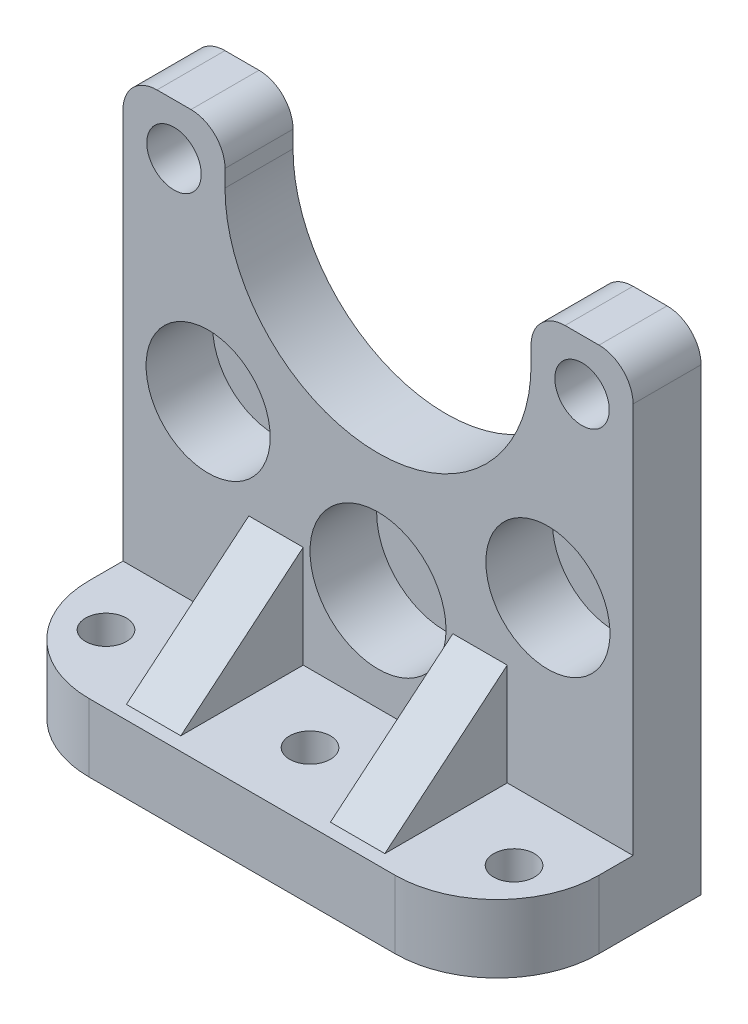
ISO-10303-21;
HEADER;
FILE_DESCRIPTION(('STEP AP214'),'2;1');
FILE_NAME('part.step','',(''),(''),'','','');
FILE_SCHEMA(('AUTOMOTIVE_DESIGN { 1 0 10303 214 1 1 1 1 }'));
ENDSEC;
DATA;
#1=APPLICATION_CONTEXT('core data for automotive mechanical design processes');
#2=APPLICATION_PROTOCOL_DEFINITION('international standard','automotive_design',2000,#1);
#3=PRODUCT_CONTEXT('',#1,'mechanical');
#4=PRODUCT('Part','Part','',(#3));
#5=PRODUCT_RELATED_PRODUCT_CATEGORY('part','',(#4));
#6=PRODUCT_DEFINITION_FORMATION('','',#4);
#7=PRODUCT_DEFINITION_CONTEXT('part definition',#1,'design');
#8=PRODUCT_DEFINITION('design','',#6,#7);
#9=PRODUCT_DEFINITION_SHAPE('','',#8);
#10=(LENGTH_UNIT() NAMED_UNIT(*) SI_UNIT(.MILLI.,.METRE.));
#11=(NAMED_UNIT(*) PLANE_ANGLE_UNIT() SI_UNIT($,.RADIAN.));
#12=(NAMED_UNIT(*) SI_UNIT($,.STERADIAN.) SOLID_ANGLE_UNIT());
#13=UNCERTAINTY_MEASURE_WITH_UNIT(LENGTH_MEASURE(1.E-05),#10,'distance_accuracy_value','');
#14=(GEOMETRIC_REPRESENTATION_CONTEXT(3) GLOBAL_UNCERTAINTY_ASSIGNED_CONTEXT((#13)) GLOBAL_UNIT_ASSIGNED_CONTEXT((#10,
#11,#12)) REPRESENTATION_CONTEXT('',''));
#15=CARTESIAN_POINT('',(0.,0.,0.));
#16=DIRECTION('',(0.,0.,1.));
#17=DIRECTION('',(1.,0.,0.));
#18=AXIS2_PLACEMENT_3D('',#15,#16,#17);
#19=CARTESIAN_POINT('',(0.,0.,10.));
#20=DIRECTION('',(0.,0.,-1.));
#21=DIRECTION('',(-1.,0.,0.));
#22=AXIS2_PLACEMENT_3D('',#19,#20,#21);
#23=PLANE('',#22);
#24=CARTESIAN_POINT('',(62.4807657696632,36.5792554758283,10.));
#25=DIRECTION('',(0.,0.,1.));
#26=DIRECTION('',(-1.,0.,0.));
#27=AXIS2_PLACEMENT_3D('',#24,#25,#26);
#28=CIRCLE('',#27,9.12473390152843);
#29=CARTESIAN_POINT('',(53.3560318681348,36.5792554758283,10.));
#30=VERTEX_POINT('',#29);
#31=EDGE_CURVE('E544',#30,#30,#28,.T.);
#32=ORIENTED_EDGE('',*,*,#31,.F.);
#33=EDGE_LOOP('',(#32));
#34=FACE_BOUND('',#33,.T.);
#35=CARTESIAN_POINT('',(12.5192342303368,36.5792554758283,10.));
#36=DIRECTION('',(0.,0.,1.));
#37=DIRECTION('',(1.,0.,0.));
#38=AXIS2_PLACEMENT_3D('',#35,#36,#37);
#39=CIRCLE('',#38,9.12473390152843);
#40=CARTESIAN_POINT('',(21.6439681318652,36.5792554758283,10.));
#41=VERTEX_POINT('',#40);
#42=EDGE_CURVE('E548',#41,#41,#39,.T.);
#43=ORIENTED_EDGE('',*,*,#42,.F.);
#44=EDGE_LOOP('',(#43));
#45=FACE_BOUND('',#44,.T.);
#46=CARTESIAN_POINT('',(37.5,25.,10.));
#47=DIRECTION('',(0.,0.,1.));
#48=DIRECTION('',(1.,0.,0.));
#49=AXIS2_PLACEMENT_3D('',#46,#47,#48);
#50=CIRCLE('',#49,10.);
#51=CARTESIAN_POINT('',(47.5,25.,10.));
#52=VERTEX_POINT('',#51);
#53=EDGE_CURVE('E557',#52,#52,#50,.T.);
#54=ORIENTED_EDGE('',*,*,#53,.F.);
#55=EDGE_LOOP('',(#54));
#56=FACE_BOUND('',#55,.T.);
#57=CARTESIAN_POINT('',(67.5,65.,10.));
#58=DIRECTION('',(0.,0.,1.));
#59=DIRECTION('',(-1.,0.,0.));
#60=AXIS2_PLACEMENT_3D('',#57,#58,#59);
#61=CIRCLE('',#60,4.00000000000002);
#62=CARTESIAN_POINT('',(63.5,65.,10.));
#63=VERTEX_POINT('',#62);
#64=EDGE_CURVE('E563',#63,#63,#61,.T.);
#65=ORIENTED_EDGE('',*,*,#64,.F.);
#66=EDGE_LOOP('',(#65));
#67=FACE_BOUND('',#66,.T.);
#68=CARTESIAN_POINT('',(7.49999999999999,65.,10.));
#69=DIRECTION('',(0.,0.,1.));
#70=DIRECTION('',(1.,0.,0.));
#71=AXIS2_PLACEMENT_3D('',#68,#69,#70);
#72=CIRCLE('',#71,4.);
#73=CARTESIAN_POINT('',(11.5,65.,10.));
#74=VERTEX_POINT('',#73);
#75=EDGE_CURVE('E569',#74,#74,#72,.T.);
#76=ORIENTED_EDGE('',*,*,#75,.F.);
#77=EDGE_LOOP('',(#76));
#78=FACE_BOUND('',#77,.T.);
#79=DIRECTION('',(-1.,0.,0.));
#80=VECTOR('',#79,1.);
#81=CARTESIAN_POINT('',(0.,72.5,10.));
#82=LINE('',#81,#80);
#83=CARTESIAN_POINT('',(10.,72.5,10.));
#84=VERTEX_POINT('',#83);
#85=CARTESIAN_POINT('',(4.99999999999997,72.5,10.));
#86=VERTEX_POINT('',#85);
#87=EDGE_CURVE('E283',#84,#86,#82,.T.);
#88=ORIENTED_EDGE('',*,*,#87,.T.);
#89=CARTESIAN_POINT('',(4.99999999999997,67.5,10.));
#90=DIRECTION('',(0.,0.,-1.));
#91=DIRECTION('',(-1.,0.,0.));
#92=AXIS2_PLACEMENT_3D('',#89,#90,#91);
#93=CIRCLE('',#92,5.);
#94=CARTESIAN_POINT('',(0.,67.5,10.));
#95=VERTEX_POINT('',#94);
#96=EDGE_CURVE('E424',#86,#95,#93,.F.);
#97=ORIENTED_EDGE('',*,*,#96,.T.);
#98=DIRECTION('',(0.,-1.,0.));
#99=VECTOR('',#98,1.);
#100=CARTESIAN_POINT('',(0.,0.,10.));
#101=LINE('',#100,#99);
#102=CARTESIAN_POINT('',(0.,10.,10.));
#103=VERTEX_POINT('',#102);
#104=EDGE_CURVE('E265',#95,#103,#101,.T.);
#105=ORIENTED_EDGE('',*,*,#104,.T.);
#106=DIRECTION('',(-1.,0.,0.));
#107=VECTOR('',#106,1.);
#108=CARTESIAN_POINT('',(0.,10.,10.));
#109=LINE('',#108,#107);
#110=CARTESIAN_POINT('',(18.5,10.,10.));
#111=VERTEX_POINT('',#110);
#112=EDGE_CURVE('E210',#111,#103,#109,.T.);
#113=ORIENTED_EDGE('',*,*,#112,.F.);
#114=DIRECTION('',(0.,-1.,0.));
#115=VECTOR('',#114,1.);
#116=CARTESIAN_POINT('',(18.5,10.,10.));
#117=LINE('',#116,#115);
#118=CARTESIAN_POINT('',(18.5,25.,10.));
#119=VERTEX_POINT('',#118);
#120=EDGE_CURVE('E201',#119,#111,#117,.T.);
#121=ORIENTED_EDGE('',*,*,#120,.F.);
#122=DIRECTION('',(-1.,0.,0.));
#123=VECTOR('',#122,1.);
#124=CARTESIAN_POINT('',(18.5,25.,10.));
#125=LINE('',#124,#123);
#126=CARTESIAN_POINT('',(26.5,25.,10.));
#127=VERTEX_POINT('',#126);
#128=EDGE_CURVE('E183',#127,#119,#125,.T.);
#129=ORIENTED_EDGE('',*,*,#128,.F.);
#130=DIRECTION('',(0.,1.,0.));
#131=VECTOR('',#130,1.);
#132=CARTESIAN_POINT('',(26.5,10.,10.));
#133=LINE('',#132,#131);
#134=CARTESIAN_POINT('',(26.5,10.,10.));
#135=VERTEX_POINT('',#134);
#136=EDGE_CURVE('E195',#135,#127,#133,.T.);
#137=ORIENTED_EDGE('',*,*,#136,.F.);
#138=CARTESIAN_POINT('',(48.5,10.,10.));
#139=VERTEX_POINT('',#138);
#140=EDGE_CURVE('E262',#139,#135,#109,.T.);
#141=ORIENTED_EDGE('',*,*,#140,.F.);
#142=DIRECTION('',(0.,-1.,0.));
#143=VECTOR('',#142,1.);
#144=CARTESIAN_POINT('',(48.5,10.,10.));
#145=LINE('',#144,#143);
#146=CARTESIAN_POINT('',(48.5,25.,10.));
#147=VERTEX_POINT('',#146);
#148=EDGE_CURVE('E585',#147,#139,#145,.T.);
#149=ORIENTED_EDGE('',*,*,#148,.F.);
#150=DIRECTION('',(-1.,0.,0.));
#151=VECTOR('',#150,1.);
#152=CARTESIAN_POINT('',(56.5,25.,10.));
#153=LINE('',#152,#151);
#154=CARTESIAN_POINT('',(56.5,25.,10.));
#155=VERTEX_POINT('',#154);
#156=EDGE_CURVE('E583',#155,#147,#153,.T.);
#157=ORIENTED_EDGE('',*,*,#156,.F.);
#158=DIRECTION('',(0.,1.,0.));
#159=VECTOR('',#158,1.);
#160=CARTESIAN_POINT('',(56.5,10.,10.));
#161=LINE('',#160,#159);
#162=CARTESIAN_POINT('',(56.5,10.,10.));
#163=VERTEX_POINT('',#162);
#164=EDGE_CURVE('E579',#163,#155,#161,.T.);
#165=ORIENTED_EDGE('',*,*,#164,.F.);
#166=CARTESIAN_POINT('',(75.,10.,10.));
#167=VERTEX_POINT('',#166);
#168=EDGE_CURVE('E246',#167,#163,#109,.T.);
#169=ORIENTED_EDGE('',*,*,#168,.F.);
#170=DIRECTION('',(0.,1.,0.));
#171=VECTOR('',#170,1.);
#172=CARTESIAN_POINT('',(75.,0.,10.));
#173=LINE('',#172,#171);
#174=CARTESIAN_POINT('',(75.,67.5,10.));
#175=VERTEX_POINT('',#174);
#176=EDGE_CURVE('E268',#167,#175,#173,.T.);
#177=ORIENTED_EDGE('',*,*,#176,.T.);
#178=CARTESIAN_POINT('',(70.,67.5,10.));
#179=DIRECTION('',(0.,0.,-1.));
#180=DIRECTION('',(-1.,0.,0.));
#181=AXIS2_PLACEMENT_3D('',#178,#179,#180);
#182=CIRCLE('',#181,5.);
#183=CARTESIAN_POINT('',(70.,72.5,10.));
#184=VERTEX_POINT('',#183);
#185=EDGE_CURVE('E413',#175,#184,#182,.F.);
#186=ORIENTED_EDGE('',*,*,#185,.T.);
#187=CARTESIAN_POINT('',(65.,72.5,10.));
#188=VERTEX_POINT('',#187);
#189=EDGE_CURVE('E279',#184,#188,#82,.T.);
#190=ORIENTED_EDGE('',*,*,#189,.T.);
#191=CARTESIAN_POINT('',(65.,67.5,10.));
#192=DIRECTION('',(0.,0.,-1.));
#193=DIRECTION('',(-1.,0.,0.));
#194=AXIS2_PLACEMENT_3D('',#191,#192,#193);
#195=CIRCLE('',#194,5.);
#196=CARTESIAN_POINT('',(60.,67.5,10.));
#197=VERTEX_POINT('',#196);
#198=EDGE_CURVE('E428',#188,#197,#195,.F.);
#199=ORIENTED_EDGE('',*,*,#198,.T.);
#200=DIRECTION('',(0.,1.,0.));
#201=VECTOR('',#200,1.);
#202=CARTESIAN_POINT('',(60.,65.,10.));
#203=LINE('',#202,#201);
#204=CARTESIAN_POINT('',(60.,65.,10.));
#205=VERTEX_POINT('',#204);
#206=EDGE_CURVE('E320',#205,#197,#203,.T.);
#207=ORIENTED_EDGE('',*,*,#206,.F.);
#208=CARTESIAN_POINT('',(37.5,65.,10.));
#209=DIRECTION('',(0.,0.,1.));
#210=DIRECTION('',(1.,0.,0.));
#211=AXIS2_PLACEMENT_3D('',#208,#209,#210);
#212=CIRCLE('',#211,22.5);
#213=CARTESIAN_POINT('',(15.,65.,10.));
#214=VERTEX_POINT('',#213);
#215=EDGE_CURVE('E325',#214,#205,#212,.T.);
#216=ORIENTED_EDGE('',*,*,#215,.F.);
#217=DIRECTION('',(0.,-1.,0.));
#218=VECTOR('',#217,1.);
#219=CARTESIAN_POINT('',(15.,65.,10.));
#220=LINE('',#219,#218);
#221=CARTESIAN_POINT('',(15.,67.5,10.));
#222=VERTEX_POINT('',#221);
#223=EDGE_CURVE('E252',#222,#214,#220,.T.);
#224=ORIENTED_EDGE('',*,*,#223,.F.);
#225=CARTESIAN_POINT('',(10.,67.5,10.));
#226=DIRECTION('',(0.,0.,-1.));
#227=DIRECTION('',(-1.,0.,0.));
#228=AXIS2_PLACEMENT_3D('',#225,#226,#227);
#229=CIRCLE('',#228,5.);
#230=EDGE_CURVE('E426',#222,#84,#229,.F.);
#231=ORIENTED_EDGE('',*,*,#230,.T.);
#232=EDGE_LOOP('',(#88,#97,#105,#113,#121,#129,#137,#141,#149,#157,#165,#169,#177,#186,#190,
#199,#207,#216,#224,#231));
#233=FACE_BOUND('',#232,.T.);
#234=ADVANCED_FACE('F35',(#34,#45,#56,#67,#78,#233),#23,.F.);
#235=CARTESIAN_POINT('',(0.,10.,30.));
#236=DIRECTION('',(0.,-1.,0.));
#237=DIRECTION('',(0.,0.,-1.));
#238=AXIS2_PLACEMENT_3D('',#235,#236,#237);
#239=PLANE('',#238);
#240=CARTESIAN_POINT('',(67.5,10.,20.));
#241=DIRECTION('',(0.,-1.,0.));
#242=DIRECTION('',(0.,0.,-1.));
#243=AXIS2_PLACEMENT_3D('',#240,#241,#242);
#244=CIRCLE('',#243,2.99999999999999);
#245=CARTESIAN_POINT('',(67.5,10.,17.));
#246=VERTEX_POINT('',#245);
#247=EDGE_CURVE('E233',#246,#246,#244,.F.);
#248=ORIENTED_EDGE('',*,*,#247,.F.);
#249=EDGE_LOOP('',(#248));
#250=FACE_BOUND('',#249,.T.);
#251=DIRECTION('',(0.,0.,-1.));
#252=VECTOR('',#251,1.);
#253=CARTESIAN_POINT('',(0.,10.,30.));
#254=LINE('',#253,#252);
#255=CARTESIAN_POINT('',(0.,10.,15.));
#256=VERTEX_POINT('',#255);
#257=EDGE_CURVE('E249',#256,#103,#254,.T.);
#258=ORIENTED_EDGE('',*,*,#257,.F.);
#259=CARTESIAN_POINT('',(15.,10.,15.));
#260=DIRECTION('',(0.,-1.,0.));
#261=DIRECTION('',(0.,0.,-1.));
#262=AXIS2_PLACEMENT_3D('',#259,#260,#261);
#263=CIRCLE('',#262,15.);
#264=CARTESIAN_POINT('',(15.,10.,30.));
#265=VERTEX_POINT('',#264);
#266=EDGE_CURVE('E43',#256,#265,#263,.F.);
#267=ORIENTED_EDGE('',*,*,#266,.T.);
#268=DIRECTION('',(-1.,0.,0.));
#269=VECTOR('',#268,1.);
#270=CARTESIAN_POINT('',(0.,10.,30.));
#271=LINE('',#270,#269);
#272=CARTESIAN_POINT('',(60.,10.,30.));
#273=VERTEX_POINT('',#272);
#274=EDGE_CURVE('E245',#273,#265,#271,.T.);
#275=ORIENTED_EDGE('',*,*,#274,.F.);
#276=CARTESIAN_POINT('',(60.,10.,15.));
#277=DIRECTION('',(0.,-1.,0.));
#278=DIRECTION('',(0.,0.,-1.));
#279=AXIS2_PLACEMENT_3D('',#276,#277,#278);
#280=CIRCLE('',#279,15.);
#281=CARTESIAN_POINT('',(75.,10.,15.));
#282=VERTEX_POINT('',#281);
#283=EDGE_CURVE('E50',#273,#282,#280,.F.);
#284=ORIENTED_EDGE('',*,*,#283,.T.);
#285=DIRECTION('',(0.,0.,-1.));
#286=VECTOR('',#285,1.);
#287=CARTESIAN_POINT('',(75.,10.,30.));
#288=LINE('',#287,#286);
#289=EDGE_CURVE('E328',#282,#167,#288,.T.);
#290=ORIENTED_EDGE('',*,*,#289,.T.);
#291=ORIENTED_EDGE('',*,*,#168,.T.);
#292=DIRECTION('',(0.,0.,-1.));
#293=VECTOR('',#292,1.);
#294=CARTESIAN_POINT('',(56.5,10.,47.));
#295=LINE('',#294,#293);
#296=CARTESIAN_POINT('',(56.5,10.,28.));
#297=VERTEX_POINT('',#296);
#298=EDGE_CURVE('E215',#297,#163,#295,.T.);
#299=ORIENTED_EDGE('',*,*,#298,.F.);
#300=DIRECTION('',(-1.,0.,0.));
#301=VECTOR('',#300,1.);
#302=CARTESIAN_POINT('',(56.5,10.,28.));
#303=LINE('',#302,#301);
#304=CARTESIAN_POINT('',(48.5,10.,28.));
#305=VERTEX_POINT('',#304);
#306=EDGE_CURVE('E211',#297,#305,#303,.T.);
#307=ORIENTED_EDGE('',*,*,#306,.T.);
#308=DIRECTION('',(0.,0.,-1.));
#309=VECTOR('',#308,1.);
#310=CARTESIAN_POINT('',(48.5,10.,47.));
#311=LINE('',#310,#309);
#312=EDGE_CURVE('E588',#305,#139,#311,.T.);
#313=ORIENTED_EDGE('',*,*,#312,.T.);
#314=ORIENTED_EDGE('',*,*,#140,.T.);
#315=DIRECTION('',(0.,0.,-1.));
#316=VECTOR('',#315,1.);
#317=CARTESIAN_POINT('',(26.5,10.,47.));
#318=LINE('',#317,#316);
#319=CARTESIAN_POINT('',(26.5,10.,28.));
#320=VERTEX_POINT('',#319);
#321=EDGE_CURVE('E194',#320,#135,#318,.T.);
#322=ORIENTED_EDGE('',*,*,#321,.F.);
#323=DIRECTION('',(-1.,0.,0.));
#324=VECTOR('',#323,1.);
#325=CARTESIAN_POINT('',(18.5,10.,28.));
#326=LINE('',#325,#324);
#327=CARTESIAN_POINT('',(18.5,10.,28.));
#328=VERTEX_POINT('',#327);
#329=EDGE_CURVE('E218',#320,#328,#326,.T.);
#330=ORIENTED_EDGE('',*,*,#329,.T.);
#331=DIRECTION('',(0.,0.,-1.));
#332=VECTOR('',#331,1.);
#333=CARTESIAN_POINT('',(18.5,10.,47.));
#334=LINE('',#333,#332);
#335=EDGE_CURVE('E202',#328,#111,#334,.T.);
#336=ORIENTED_EDGE('',*,*,#335,.T.);
#337=ORIENTED_EDGE('',*,*,#112,.T.);
#338=EDGE_LOOP('',(#258,#267,#275,#284,#290,#291,#299,#307,#313,#314,#322,#330,#336,#337));
#339=FACE_BOUND('',#338,.T.);
#340=CARTESIAN_POINT('',(7.50000000000004,10.,20.));
#341=DIRECTION('',(0.,-1.,0.));
#342=DIRECTION('',(0.,0.,-1.));
#343=AXIS2_PLACEMENT_3D('',#340,#341,#342);
#344=CIRCLE('',#343,2.99999999999999);
#345=CARTESIAN_POINT('',(7.50000000000004,10.,17.));
#346=VERTEX_POINT('',#345);
#347=EDGE_CURVE('E239',#346,#346,#344,.F.);
#348=ORIENTED_EDGE('',*,*,#347,.F.);
#349=EDGE_LOOP('',(#348));
#350=FACE_BOUND('',#349,.T.);
#351=CARTESIAN_POINT('',(37.5,10.,20.));
#352=DIRECTION('',(0.,-1.,0.));
#353=DIRECTION('',(0.,0.,-1.));
#354=AXIS2_PLACEMENT_3D('',#351,#352,#353);
#355=CIRCLE('',#354,3.00000000000001);
#356=CARTESIAN_POINT('',(37.5,10.,17.));
#357=VERTEX_POINT('',#356);
#358=EDGE_CURVE('E227',#357,#357,#355,.F.);
#359=ORIENTED_EDGE('',*,*,#358,.F.);
#360=EDGE_LOOP('',(#359));
#361=FACE_BOUND('',#360,.T.);
#362=ADVANCED_FACE('F338',(#250,#339,#350,#361),#239,.F.);
#363=CARTESIAN_POINT('',(0.,72.5,10.));
#364=DIRECTION('',(0.,-1.,0.));
#365=DIRECTION('',(0.,0.,-1.));
#366=AXIS2_PLACEMENT_3D('',#363,#364,#365);
#367=PLANE('',#366);
#368=DIRECTION('',(-1.,0.,0.));
#369=VECTOR('',#368,1.);
#370=CARTESIAN_POINT('',(0.,72.5,0.));
#371=LINE('',#370,#369);
#372=CARTESIAN_POINT('',(70.,72.5,0.));
#373=VERTEX_POINT('',#372);
#374=CARTESIAN_POINT('',(65.,72.5,0.));
#375=VERTEX_POINT('',#374);
#376=EDGE_CURVE('E269',#373,#375,#371,.T.);
#377=ORIENTED_EDGE('',*,*,#376,.T.);
#378=DIRECTION('',(0.,0.,1.));
#379=VECTOR('',#378,1.);
#380=CARTESIAN_POINT('',(65.,72.5,10.));
#381=LINE('',#380,#379);
#382=EDGE_CURVE('E415',#375,#188,#381,.T.);
#383=ORIENTED_EDGE('',*,*,#382,.T.);
#384=ORIENTED_EDGE('',*,*,#189,.F.);
#385=DIRECTION('',(0.,0.,-1.));
#386=VECTOR('',#385,1.);
#387=CARTESIAN_POINT('',(70.,72.5,10.));
#388=LINE('',#387,#386);
#389=EDGE_CURVE('E420',#184,#373,#388,.T.);
#390=ORIENTED_EDGE('',*,*,#389,.T.);
#391=EDGE_LOOP('',(#377,#383,#384,#390));
#392=FACE_BOUND('',#391,.T.);
#393=ADVANCED_FACE('F364',(#392),#367,.F.);
#394=CARTESIAN_POINT('',(0.,0.,10.));
#395=DIRECTION('',(1.,0.,0.));
#396=DIRECTION('',(0.,1.,0.));
#397=AXIS2_PLACEMENT_3D('',#394,#395,#396);
#398=PLANE('',#397);
#399=DIRECTION('',(0.,0.,-1.));
#400=VECTOR('',#399,1.);
#401=CARTESIAN_POINT('',(0.,0.,10.));
#402=LINE('',#401,#400);
#403=CARTESIAN_POINT('',(0.,0.,15.));
#404=VERTEX_POINT('',#403);
#405=CARTESIAN_POINT('',(0.,0.,0.));
#406=VERTEX_POINT('',#405);
#407=EDGE_CURVE('E284',#404,#406,#402,.T.);
#408=ORIENTED_EDGE('',*,*,#407,.F.);
#409=DIRECTION('',(0.,-1.,0.));
#410=VECTOR('',#409,1.);
#411=CARTESIAN_POINT('',(0.,0.,15.));
#412=LINE('',#411,#410);
#413=EDGE_CURVE('E58',#404,#256,#412,.F.);
#414=ORIENTED_EDGE('',*,*,#413,.T.);
#415=ORIENTED_EDGE('',*,*,#257,.T.);
#416=ORIENTED_EDGE('',*,*,#104,.F.);
#417=DIRECTION('',(0.,0.,-1.));
#418=VECTOR('',#417,1.);
#419=CARTESIAN_POINT('',(0.,67.5,10.));
#420=LINE('',#419,#418);
#421=CARTESIAN_POINT('',(0.,67.5,0.));
#422=VERTEX_POINT('',#421);
#423=EDGE_CURVE('E270',#95,#422,#420,.T.);
#424=ORIENTED_EDGE('',*,*,#423,.T.);
#425=DIRECTION('',(0.,-1.,0.));
#426=VECTOR('',#425,1.);
#427=CARTESIAN_POINT('',(0.,0.,0.));
#428=LINE('',#427,#426);
#429=EDGE_CURVE('E296',#422,#406,#428,.T.);
#430=ORIENTED_EDGE('',*,*,#429,.T.);
#431=EDGE_LOOP('',(#408,#414,#415,#416,#424,#430));
#432=FACE_BOUND('',#431,.T.);
#433=ADVANCED_FACE('F362',(#432),#398,.F.);
#434=CARTESIAN_POINT('',(0.,0.,10.));
#435=DIRECTION('',(0.,1.,0.));
#436=DIRECTION('',(0.,0.,1.));
#437=AXIS2_PLACEMENT_3D('',#434,#435,#436);
#438=PLANE('',#437);
#439=CARTESIAN_POINT('',(37.5,0.,20.));
#440=DIRECTION('',(0.,-1.,0.));
#441=DIRECTION('',(0.,0.,-1.));
#442=AXIS2_PLACEMENT_3D('',#439,#440,#441);
#443=CIRCLE('',#442,3.00000000000001);
#444=CARTESIAN_POINT('',(37.5,0.,17.));
#445=VERTEX_POINT('',#444);
#446=EDGE_CURVE('E224',#445,#445,#443,.T.);
#447=ORIENTED_EDGE('',*,*,#446,.F.);
#448=EDGE_LOOP('',(#447));
#449=FACE_BOUND('',#448,.T.);
#450=CARTESIAN_POINT('',(67.5,0.,20.));
#451=DIRECTION('',(0.,-1.,0.));
#452=DIRECTION('',(0.,0.,-1.));
#453=AXIS2_PLACEMENT_3D('',#450,#451,#452);
#454=CIRCLE('',#453,2.99999999999999);
#455=CARTESIAN_POINT('',(67.5,0.,17.));
#456=VERTEX_POINT('',#455);
#457=EDGE_CURVE('E230',#456,#456,#454,.T.);
#458=ORIENTED_EDGE('',*,*,#457,.F.);
#459=EDGE_LOOP('',(#458));
#460=FACE_BOUND('',#459,.T.);
#461=CARTESIAN_POINT('',(7.50000000000004,0.,20.));
#462=DIRECTION('',(0.,-1.,0.));
#463=DIRECTION('',(0.,0.,-1.));
#464=AXIS2_PLACEMENT_3D('',#461,#462,#463);
#465=CIRCLE('',#464,2.99999999999999);
#466=CARTESIAN_POINT('',(7.50000000000004,0.,17.));
#467=VERTEX_POINT('',#466);
#468=EDGE_CURVE('E236',#467,#467,#465,.T.);
#469=ORIENTED_EDGE('',*,*,#468,.F.);
#470=EDGE_LOOP('',(#469));
#471=FACE_BOUND('',#470,.T.);
#472=DIRECTION('',(1.,0.,0.));
#473=VECTOR('',#472,1.);
#474=CARTESIAN_POINT('',(0.,0.,30.));
#475=LINE('',#474,#473);
#476=CARTESIAN_POINT('',(15.,0.,30.));
#477=VERTEX_POINT('',#476);
#478=CARTESIAN_POINT('',(60.,0.,30.));
#479=VERTEX_POINT('',#478);
#480=EDGE_CURVE('E242',#477,#479,#475,.T.);
#481=ORIENTED_EDGE('',*,*,#480,.F.);
#482=CARTESIAN_POINT('',(15.,0.,15.));
#483=DIRECTION('',(0.,1.,0.));
#484=DIRECTION('',(0.,0.,1.));
#485=AXIS2_PLACEMENT_3D('',#482,#483,#484);
#486=CIRCLE('',#485,15.);
#487=EDGE_CURVE('E351',#477,#404,#486,.F.);
#488=ORIENTED_EDGE('',*,*,#487,.T.);
#489=ORIENTED_EDGE('',*,*,#407,.T.);
#490=DIRECTION('',(1.,0.,0.));
#491=VECTOR('',#490,1.);
#492=CARTESIAN_POINT('',(0.,0.,0.));
#493=LINE('',#492,#491);
#494=CARTESIAN_POINT('',(75.,0.,0.));
#495=VERTEX_POINT('',#494);
#496=EDGE_CURVE('E294',#406,#495,#493,.T.);
#497=ORIENTED_EDGE('',*,*,#496,.T.);
#498=DIRECTION('',(0.,0.,-1.));
#499=VECTOR('',#498,1.);
#500=CARTESIAN_POINT('',(75.,0.,10.));
#501=LINE('',#500,#499);
#502=CARTESIAN_POINT('',(75.,0.,15.));
#503=VERTEX_POINT('',#502);
#504=EDGE_CURVE('E286',#503,#495,#501,.T.);
#505=ORIENTED_EDGE('',*,*,#504,.F.);
#506=CARTESIAN_POINT('',(60.,0.,15.));
#507=DIRECTION('',(0.,1.,0.));
#508=DIRECTION('',(0.,0.,1.));
#509=AXIS2_PLACEMENT_3D('',#506,#507,#508);
#510=CIRCLE('',#509,15.);
#511=EDGE_CURVE('E352',#503,#479,#510,.F.);
#512=ORIENTED_EDGE('',*,*,#511,.T.);
#513=EDGE_LOOP('',(#481,#488,#489,#497,#505,#512));
#514=FACE_BOUND('',#513,.T.);
#515=ADVANCED_FACE('F361',(#449,#460,#471,#514),#438,.F.);
#516=CARTESIAN_POINT('',(75.,0.,10.));
#517=DIRECTION('',(-1.,0.,0.));
#518=DIRECTION('',(0.,-1.,0.));
#519=AXIS2_PLACEMENT_3D('',#516,#517,#518);
#520=PLANE('',#519);
#521=ORIENTED_EDGE('',*,*,#289,.F.);
#522=DIRECTION('',(0.,1.,0.));
#523=VECTOR('',#522,1.);
#524=CARTESIAN_POINT('',(75.,0.,15.));
#525=LINE('',#524,#523);
#526=EDGE_CURVE('E12',#282,#503,#525,.F.);
#527=ORIENTED_EDGE('',*,*,#526,.T.);
#528=ORIENTED_EDGE('',*,*,#504,.T.);
#529=DIRECTION('',(0.,1.,0.));
#530=VECTOR('',#529,1.);
#531=CARTESIAN_POINT('',(75.,0.,0.));
#532=LINE('',#531,#530);
#533=CARTESIAN_POINT('',(75.,67.5,0.));
#534=VERTEX_POINT('',#533);
#535=EDGE_CURVE('E291',#495,#534,#532,.T.);
#536=ORIENTED_EDGE('',*,*,#535,.T.);
#537=DIRECTION('',(0.,0.,-1.));
#538=VECTOR('',#537,1.);
#539=CARTESIAN_POINT('',(75.,67.5,10.));
#540=LINE('',#539,#538);
#541=EDGE_CURVE('E355',#534,#175,#540,.F.);
#542=ORIENTED_EDGE('',*,*,#541,.T.);
#543=ORIENTED_EDGE('',*,*,#176,.F.);
#544=EDGE_LOOP('',(#521,#527,#528,#536,#542,#543));
#545=FACE_BOUND('',#544,.T.);
#546=ADVANCED_FACE('F370',(#545),#520,.F.);
#547=CARTESIAN_POINT('',(10.,72.5,0.));
#548=VERTEX_POINT('',#547);
#549=CARTESIAN_POINT('',(4.99999999999997,72.5,0.));
#550=VERTEX_POINT('',#549);
#551=EDGE_CURVE('E288',#548,#550,#371,.T.);
#552=ORIENTED_EDGE('',*,*,#551,.T.);
#553=DIRECTION('',(0.,0.,-1.));
#554=VECTOR('',#553,1.);
#555=CARTESIAN_POINT('',(4.99999999999997,72.5,10.));
#556=LINE('',#555,#554);
#557=EDGE_CURVE('E431',#550,#86,#556,.F.);
#558=ORIENTED_EDGE('',*,*,#557,.T.);
#559=ORIENTED_EDGE('',*,*,#87,.F.);
#560=DIRECTION('',(0.,0.,1.));
#561=VECTOR('',#560,1.);
#562=CARTESIAN_POINT('',(10.,72.5,10.));
#563=LINE('',#562,#561);
#564=EDGE_CURVE('E433',#84,#548,#563,.F.);
#565=ORIENTED_EDGE('',*,*,#564,.T.);
#566=EDGE_LOOP('',(#552,#558,#559,#565));
#567=FACE_BOUND('',#566,.T.);
#568=ADVANCED_FACE('F375',(#567),#367,.F.);
#569=CARTESIAN_POINT('',(0.,0.,0.));
#570=DIRECTION('',(0.,0.,-1.));
#571=DIRECTION('',(-1.,0.,0.));
#572=AXIS2_PLACEMENT_3D('',#569,#570,#571);
#573=PLANE('',#572);
#574=ORIENTED_EDGE('',*,*,#429,.F.);
#575=CARTESIAN_POINT('',(4.99999999999997,67.5,0.));
#576=DIRECTION('',(0.,0.,-1.));
#577=DIRECTION('',(-1.,0.,0.));
#578=AXIS2_PLACEMENT_3D('',#575,#576,#577);
#579=CIRCLE('',#578,5.);
#580=EDGE_CURVE('E435',#422,#550,#579,.T.);
#581=ORIENTED_EDGE('',*,*,#580,.T.);
#582=ORIENTED_EDGE('',*,*,#551,.F.);
#583=CARTESIAN_POINT('',(10.,67.5,0.));
#584=DIRECTION('',(0.,0.,-1.));
#585=DIRECTION('',(-1.,0.,0.));
#586=AXIS2_PLACEMENT_3D('',#583,#584,#585);
#587=CIRCLE('',#586,5.);
#588=CARTESIAN_POINT('',(15.,67.5,0.));
#589=VERTEX_POINT('',#588);
#590=EDGE_CURVE('E437',#548,#589,#587,.T.);
#591=ORIENTED_EDGE('',*,*,#590,.T.);
#592=DIRECTION('',(0.,-1.,0.));
#593=VECTOR('',#592,1.);
#594=CARTESIAN_POINT('',(15.,65.,0.));
#595=LINE('',#594,#593);
#596=CARTESIAN_POINT('',(15.,65.,0.));
#597=VERTEX_POINT('',#596);
#598=EDGE_CURVE('E313',#589,#597,#595,.T.);
#599=ORIENTED_EDGE('',*,*,#598,.T.);
#600=CARTESIAN_POINT('',(37.5,65.,0.));
#601=DIRECTION('',(0.,0.,-1.));
#602=DIRECTION('',(-1.,0.,0.));
#603=AXIS2_PLACEMENT_3D('',#600,#601,#602);
#604=CIRCLE('',#603,22.5);
#605=CARTESIAN_POINT('',(60.,65.,0.));
#606=VERTEX_POINT('',#605);
#607=EDGE_CURVE('E301',#597,#606,#604,.F.);
#608=ORIENTED_EDGE('',*,*,#607,.T.);
#609=DIRECTION('',(0.,1.,0.));
#610=VECTOR('',#609,1.);
#611=CARTESIAN_POINT('',(60.,65.,0.));
#612=LINE('',#611,#610);
#613=CARTESIAN_POINT('',(60.,67.5,0.));
#614=VERTEX_POINT('',#613);
#615=EDGE_CURVE('E316',#606,#614,#612,.T.);
#616=ORIENTED_EDGE('',*,*,#615,.T.);
#617=CARTESIAN_POINT('',(65.,67.5,0.));
#618=DIRECTION('',(0.,0.,-1.));
#619=DIRECTION('',(-1.,0.,0.));
#620=AXIS2_PLACEMENT_3D('',#617,#618,#619);
#621=CIRCLE('',#620,5.);
#622=EDGE_CURVE('E439',#614,#375,#621,.T.);
#623=ORIENTED_EDGE('',*,*,#622,.T.);
#624=ORIENTED_EDGE('',*,*,#376,.F.);
#625=CARTESIAN_POINT('',(70.,67.5,0.));
#626=DIRECTION('',(0.,0.,-1.));
#627=DIRECTION('',(-1.,0.,0.));
#628=AXIS2_PLACEMENT_3D('',#625,#626,#627);
#629=CIRCLE('',#628,5.);
#630=EDGE_CURVE('E411',#373,#534,#629,.T.);
#631=ORIENTED_EDGE('',*,*,#630,.T.);
#632=ORIENTED_EDGE('',*,*,#535,.F.);
#633=ORIENTED_EDGE('',*,*,#496,.F.);
#634=EDGE_LOOP('',(#574,#581,#582,#591,#599,#608,#616,#623,#624,#631,#632,#633));
#635=FACE_BOUND('',#634,.T.);
#636=ADVANCED_FACE('F391',(#635),#573,.T.);
#637=CARTESIAN_POINT('',(60.,65.,-54.0832691319598));
#638=DIRECTION('',(1.,0.,0.));
#639=DIRECTION('',(0.,0.,-1.));
#640=AXIS2_PLACEMENT_3D('',#637,#638,#639);
#641=PLANE('',#640);
#642=ORIENTED_EDGE('',*,*,#206,.T.);
#643=DIRECTION('',(0.,0.,1.));
#644=VECTOR('',#643,1.);
#645=CARTESIAN_POINT('',(60.,67.5,-54.0832691319598));
#646=LINE('',#645,#644);
#647=EDGE_CURVE('E414',#197,#614,#646,.F.);
#648=ORIENTED_EDGE('',*,*,#647,.T.);
#649=ORIENTED_EDGE('',*,*,#615,.F.);
#650=DIRECTION('',(0.,0.,1.));
#651=VECTOR('',#650,1.);
#652=CARTESIAN_POINT('',(60.,65.,-54.0832691319598));
#653=LINE('',#652,#651);
#654=EDGE_CURVE('E275',#606,#205,#653,.T.);
#655=ORIENTED_EDGE('',*,*,#654,.T.);
#656=EDGE_LOOP('',(#642,#648,#649,#655));
#657=FACE_BOUND('',#656,.T.);
#658=ADVANCED_FACE('F389',(#657),#641,.F.);
#659=CARTESIAN_POINT('',(15.,65.,-54.0832691319598));
#660=DIRECTION('',(-1.,0.,0.));
#661=DIRECTION('',(0.,0.,1.));
#662=AXIS2_PLACEMENT_3D('',#659,#660,#661);
#663=PLANE('',#662);
#664=ORIENTED_EDGE('',*,*,#598,.F.);
#665=DIRECTION('',(0.,0.,1.));
#666=VECTOR('',#665,1.);
#667=CARTESIAN_POINT('',(15.,67.5,-54.0832691319598));
#668=LINE('',#667,#666);
#669=EDGE_CURVE('E422',#589,#222,#668,.T.);
#670=ORIENTED_EDGE('',*,*,#669,.T.);
#671=ORIENTED_EDGE('',*,*,#223,.T.);
#672=DIRECTION('',(0.,0.,1.));
#673=VECTOR('',#672,1.);
#674=CARTESIAN_POINT('',(15.,65.,-54.0832691319598));
#675=LINE('',#674,#673);
#676=EDGE_CURVE('E307',#597,#214,#675,.T.);
#677=ORIENTED_EDGE('',*,*,#676,.F.);
#678=EDGE_LOOP('',(#664,#670,#671,#677));
#679=FACE_BOUND('',#678,.T.);
#680=ADVANCED_FACE('F458',(#679),#663,.F.);
#681=CARTESIAN_POINT('',(37.5,65.,-54.0832691319598));
#682=DIRECTION('',(0.,0.,1.));
#683=DIRECTION('',(1.,0.,0.));
#684=AXIS2_PLACEMENT_3D('',#681,#682,#683);
#685=CYLINDRICAL_SURFACE('',#684,22.5);
#686=ORIENTED_EDGE('',*,*,#676,.T.);
#687=ORIENTED_EDGE('',*,*,#215,.T.);
#688=ORIENTED_EDGE('',*,*,#654,.F.);
#689=ORIENTED_EDGE('',*,*,#607,.F.);
#690=EDGE_LOOP('',(#686,#687,#688,#689));
#691=FACE_BOUND('',#690,.T.);
#692=ADVANCED_FACE('F462',(#691),#685,.F.);
#693=CARTESIAN_POINT('',(0.,0.,30.));
#694=DIRECTION('',(0.,0.,-1.));
#695=DIRECTION('',(-1.,0.,0.));
#696=AXIS2_PLACEMENT_3D('',#693,#694,#695);
#697=PLANE('',#696);
#698=ORIENTED_EDGE('',*,*,#274,.T.);
#699=DIRECTION('',(0.,-1.,0.));
#700=VECTOR('',#699,1.);
#701=CARTESIAN_POINT('',(15.,0.,30.));
#702=LINE('',#701,#700);
#703=EDGE_CURVE('E346',#265,#477,#702,.T.);
#704=ORIENTED_EDGE('',*,*,#703,.T.);
#705=ORIENTED_EDGE('',*,*,#480,.T.);
#706=DIRECTION('',(0.,1.,0.));
#707=VECTOR('',#706,1.);
#708=CARTESIAN_POINT('',(60.,0.,30.));
#709=LINE('',#708,#707);
#710=EDGE_CURVE('E349',#479,#273,#709,.T.);
#711=ORIENTED_EDGE('',*,*,#710,.T.);
#712=EDGE_LOOP('',(#698,#704,#705,#711));
#713=FACE_BOUND('',#712,.T.);
#714=ADVANCED_FACE('F345',(#713),#697,.F.);
#715=CARTESIAN_POINT('',(7.50000000000004,18.4852813742386,20.));
#716=DIRECTION('',(0.,-1.,0.));
#717=DIRECTION('',(0.,0.,-1.));
#718=AXIS2_PLACEMENT_3D('',#715,#716,#717);
#719=CYLINDRICAL_SURFACE('',#718,2.99999999999999);
#720=ORIENTED_EDGE('',*,*,#347,.T.);
#721=EDGE_LOOP('',(#720));
#722=FACE_BOUND('',#721,.T.);
#723=ORIENTED_EDGE('',*,*,#468,.T.);
#724=EDGE_LOOP('',(#723));
#725=FACE_BOUND('',#724,.T.);
#726=ADVANCED_FACE('F470',(#722,#725),#719,.F.);
#727=CARTESIAN_POINT('',(67.5,18.4852813742386,20.));
#728=DIRECTION('',(0.,-1.,0.));
#729=DIRECTION('',(0.,0.,-1.));
#730=AXIS2_PLACEMENT_3D('',#727,#728,#729);
#731=CYLINDRICAL_SURFACE('',#730,2.99999999999999);
#732=ORIENTED_EDGE('',*,*,#247,.T.);
#733=EDGE_LOOP('',(#732));
#734=FACE_BOUND('',#733,.T.);
#735=ORIENTED_EDGE('',*,*,#457,.T.);
#736=EDGE_LOOP('',(#735));
#737=FACE_BOUND('',#736,.T.);
#738=ADVANCED_FACE('F473',(#734,#737),#731,.F.);
#739=CARTESIAN_POINT('',(37.5,18.4852813742386,20.));
#740=DIRECTION('',(0.,-1.,0.));
#741=DIRECTION('',(0.,0.,-1.));
#742=AXIS2_PLACEMENT_3D('',#739,#740,#741);
#743=CYLINDRICAL_SURFACE('',#742,3.00000000000001);
#744=ORIENTED_EDGE('',*,*,#358,.T.);
#745=EDGE_LOOP('',(#744));
#746=FACE_BOUND('',#745,.T.);
#747=ORIENTED_EDGE('',*,*,#446,.T.);
#748=EDGE_LOOP('',(#747));
#749=FACE_BOUND('',#748,.T.);
#750=ADVANCED_FACE('F477',(#746,#749),#743,.F.);
#751=CARTESIAN_POINT('',(26.5,10.,47.));
#752=DIRECTION('',(-1.,0.,0.));
#753=DIRECTION('',(0.,0.,1.));
#754=AXIS2_PLACEMENT_3D('',#751,#752,#753);
#755=PLANE('',#754);
#756=ORIENTED_EDGE('',*,*,#136,.T.);
#757=DIRECTION('',(0.,-0.64018439966448,0.768221279597376));
#758=VECTOR('',#757,1.);
#759=CARTESIAN_POINT('',(26.5,0.655737704918023,39.2131147540984));
#760=LINE('',#759,#758);
#761=EDGE_CURVE('E189',#127,#320,#760,.T.);
#762=ORIENTED_EDGE('',*,*,#761,.T.);
#763=ORIENTED_EDGE('',*,*,#321,.T.);
#764=EDGE_LOOP('',(#756,#762,#763));
#765=FACE_BOUND('',#764,.T.);
#766=ADVANCED_FACE('F481',(#765),#755,.F.);
#767=CARTESIAN_POINT('',(18.5,10.,47.));
#768=DIRECTION('',(1.,0.,0.));
#769=DIRECTION('',(0.,1.,0.));
#770=AXIS2_PLACEMENT_3D('',#767,#768,#769);
#771=PLANE('',#770);
#772=ORIENTED_EDGE('',*,*,#335,.F.);
#773=DIRECTION('',(0.,-0.64018439966448,0.768221279597376));
#774=VECTOR('',#773,1.);
#775=CARTESIAN_POINT('',(18.5,25.,10.));
#776=LINE('',#775,#774);
#777=EDGE_CURVE('E186',#119,#328,#776,.T.);
#778=ORIENTED_EDGE('',*,*,#777,.F.);
#779=ORIENTED_EDGE('',*,*,#120,.T.);
#780=EDGE_LOOP('',(#772,#778,#779));
#781=FACE_BOUND('',#780,.T.);
#782=ADVANCED_FACE('F200',(#781),#771,.F.);
#783=CARTESIAN_POINT('',(48.5,10.,47.));
#784=DIRECTION('',(1.,0.,0.));
#785=DIRECTION('',(0.,1.,0.));
#786=AXIS2_PLACEMENT_3D('',#783,#784,#785);
#787=PLANE('',#786);
#788=ORIENTED_EDGE('',*,*,#312,.F.);
#789=DIRECTION('',(0.,0.64018439966448,-0.768221279597376));
#790=VECTOR('',#789,1.);
#791=CARTESIAN_POINT('',(48.5,0.655737704918025,39.2131147540984));
#792=LINE('',#791,#790);
#793=EDGE_CURVE('E576',#305,#147,#792,.T.);
#794=ORIENTED_EDGE('',*,*,#793,.T.);
#795=ORIENTED_EDGE('',*,*,#148,.T.);
#796=EDGE_LOOP('',(#788,#794,#795));
#797=FACE_BOUND('',#796,.T.);
#798=ADVANCED_FACE('F485',(#797),#787,.F.);
#799=CARTESIAN_POINT('',(56.5,10.,47.));
#800=DIRECTION('',(-1.,0.,0.));
#801=DIRECTION('',(0.,0.,1.));
#802=AXIS2_PLACEMENT_3D('',#799,#800,#801);
#803=PLANE('',#802);
#804=ORIENTED_EDGE('',*,*,#164,.T.);
#805=DIRECTION('',(0.,-0.64018439966448,0.768221279597376));
#806=VECTOR('',#805,1.);
#807=CARTESIAN_POINT('',(56.5,0.655737704918027,39.2131147540984));
#808=LINE('',#807,#806);
#809=EDGE_CURVE('E203',#155,#297,#808,.T.);
#810=ORIENTED_EDGE('',*,*,#809,.T.);
#811=ORIENTED_EDGE('',*,*,#298,.T.);
#812=EDGE_LOOP('',(#804,#810,#811));
#813=FACE_BOUND('',#812,.T.);
#814=ADVANCED_FACE('F489',(#813),#803,.F.);
#815=CARTESIAN_POINT('',(75.00005,25.,10.));
#816=DIRECTION('',(0.,-0.768221279597376,-0.64018439966448));
#817=DIRECTION('',(0.,0.64018439966448,-0.768221279597376));
#818=AXIS2_PLACEMENT_3D('',#815,#816,#817);
#819=PLANE('',#818);
#820=ORIENTED_EDGE('',*,*,#306,.F.);
#821=ORIENTED_EDGE('',*,*,#809,.F.);
#822=ORIENTED_EDGE('',*,*,#156,.T.);
#823=ORIENTED_EDGE('',*,*,#793,.F.);
#824=EDGE_LOOP('',(#820,#821,#822,#823));
#825=FACE_BOUND('',#824,.T.);
#826=ADVANCED_FACE('F492',(#825),#819,.F.);
#827=ORIENTED_EDGE('',*,*,#128,.T.);
#828=ORIENTED_EDGE('',*,*,#777,.T.);
#829=ORIENTED_EDGE('',*,*,#329,.F.);
#830=ORIENTED_EDGE('',*,*,#761,.F.);
#831=EDGE_LOOP('',(#827,#828,#829,#830));
#832=FACE_BOUND('',#831,.T.);
#833=ADVANCED_FACE('F185',(#832),#819,.F.);
#834=CARTESIAN_POINT('',(0.,0.,0.2));
#835=DIRECTION('',(0.,0.,-1.));
#836=DIRECTION('',(-1.,0.,0.));
#837=AXIS2_PLACEMENT_3D('',#834,#835,#836);
#838=PLANE('',#837);
#839=CARTESIAN_POINT('',(7.49999999999999,65.,0.199999999999999));
#840=DIRECTION('',(0.,0.,-1.));
#841=DIRECTION('',(-1.,0.,0.));
#842=AXIS2_PLACEMENT_3D('',#839,#840,#841);
#843=CIRCLE('',#842,4.);
#844=CARTESIAN_POINT('',(3.49999999999998,65.,0.199999999999999));
#845=VERTEX_POINT('',#844);
#846=EDGE_CURVE('E204',#845,#845,#843,.F.);
#847=ORIENTED_EDGE('',*,*,#846,.T.);
#848=EDGE_LOOP('',(#847));
#849=FACE_BOUND('',#848,.T.);
#850=ADVANCED_FACE('F499',(#849),#838,.F.);
#851=CARTESIAN_POINT('',(7.49999999999999,65.,-28.2842712474619));
#852=DIRECTION('',(0.,0.,1.));
#853=DIRECTION('',(1.,0.,0.));
#854=AXIS2_PLACEMENT_3D('',#851,#852,#853);
#855=CYLINDRICAL_SURFACE('',#854,4.);
#856=ORIENTED_EDGE('',*,*,#75,.T.);
#857=EDGE_LOOP('',(#856));
#858=FACE_BOUND('',#857,.T.);
#859=ORIENTED_EDGE('',*,*,#846,.F.);
#860=EDGE_LOOP('',(#859));
#861=FACE_BOUND('',#860,.T.);
#862=ADVANCED_FACE('F502',(#858,#861),#855,.F.);
#863=CARTESIAN_POINT('',(0.,0.,0.2));
#864=DIRECTION('',(0.,0.,-1.));
#865=DIRECTION('',(-1.,0.,0.));
#866=AXIS2_PLACEMENT_3D('',#863,#864,#865);
#867=PLANE('',#866);
#868=CARTESIAN_POINT('',(67.5,65.,0.199999999999999));
#869=DIRECTION('',(0.,0.,-1.));
#870=DIRECTION('',(-1.,0.,0.));
#871=AXIS2_PLACEMENT_3D('',#868,#869,#870);
#872=CIRCLE('',#871,4.00000000000002);
#873=CARTESIAN_POINT('',(63.5,65.,0.199999999999999));
#874=VERTEX_POINT('',#873);
#875=EDGE_CURVE('E566',#874,#874,#872,.F.);
#876=ORIENTED_EDGE('',*,*,#875,.T.);
#877=EDGE_LOOP('',(#876));
#878=FACE_BOUND('',#877,.T.);
#879=ADVANCED_FACE('F506',(#878),#867,.F.);
#880=CARTESIAN_POINT('',(67.5,65.,-28.2842712474619));
#881=DIRECTION('',(0.,0.,1.));
#882=DIRECTION('',(1.,0.,0.));
#883=AXIS2_PLACEMENT_3D('',#880,#881,#882);
#884=CYLINDRICAL_SURFACE('',#883,4.00000000000002);
#885=ORIENTED_EDGE('',*,*,#64,.T.);
#886=EDGE_LOOP('',(#885));
#887=FACE_BOUND('',#886,.T.);
#888=ORIENTED_EDGE('',*,*,#875,.F.);
#889=EDGE_LOOP('',(#888));
#890=FACE_BOUND('',#889,.T.);
#891=ADVANCED_FACE('F510',(#887,#890),#884,.F.);
#892=CARTESIAN_POINT('',(0.,0.,0.2));
#893=DIRECTION('',(0.,0.,-1.));
#894=DIRECTION('',(-1.,0.,0.));
#895=AXIS2_PLACEMENT_3D('',#892,#893,#894);
#896=PLANE('',#895);
#897=CARTESIAN_POINT('',(37.5,25.,0.199999999999999));
#898=DIRECTION('',(0.,0.,-1.));
#899=DIRECTION('',(-1.,0.,0.));
#900=AXIS2_PLACEMENT_3D('',#897,#898,#899);
#901=CIRCLE('',#900,10.);
#902=CARTESIAN_POINT('',(27.5,25.,0.199999999999999));
#903=VERTEX_POINT('',#902);
#904=EDGE_CURVE('E560',#903,#903,#901,.F.);
#905=ORIENTED_EDGE('',*,*,#904,.T.);
#906=EDGE_LOOP('',(#905));
#907=FACE_BOUND('',#906,.T.);
#908=ADVANCED_FACE('F514',(#907),#896,.F.);
#909=CARTESIAN_POINT('',(37.5,25.,-28.2842712474619));
#910=DIRECTION('',(0.,0.,1.));
#911=DIRECTION('',(1.,0.,0.));
#912=AXIS2_PLACEMENT_3D('',#909,#910,#911);
#913=CYLINDRICAL_SURFACE('',#912,10.);
#914=ORIENTED_EDGE('',*,*,#53,.T.);
#915=EDGE_LOOP('',(#914));
#916=FACE_BOUND('',#915,.T.);
#917=ORIENTED_EDGE('',*,*,#904,.F.);
#918=EDGE_LOOP('',(#917));
#919=FACE_BOUND('',#918,.T.);
#920=ADVANCED_FACE('F518',(#916,#919),#913,.F.);
#921=CARTESIAN_POINT('',(0.,0.,0.2));
#922=DIRECTION('',(0.,0.,-1.));
#923=DIRECTION('',(-1.,0.,0.));
#924=AXIS2_PLACEMENT_3D('',#921,#922,#923);
#925=PLANE('',#924);
#926=CARTESIAN_POINT('',(12.5192342303368,36.5792554758283,0.199999999999999));
#927=DIRECTION('',(0.,0.,-1.));
#928=DIRECTION('',(-1.,0.,0.));
#929=AXIS2_PLACEMENT_3D('',#926,#927,#928);
#930=CIRCLE('',#929,9.12473390152843);
#931=CARTESIAN_POINT('',(3.39450032880832,36.5792554758283,0.199999999999999));
#932=VERTEX_POINT('',#931);
#933=EDGE_CURVE('E551',#932,#932,#930,.F.);
#934=ORIENTED_EDGE('',*,*,#933,.T.);
#935=EDGE_LOOP('',(#934));
#936=FACE_BOUND('',#935,.T.);
#937=ADVANCED_FACE('F522',(#936),#925,.F.);
#938=CARTESIAN_POINT('',(12.5192342303368,36.5792554758283,-28.2842712474619));
#939=DIRECTION('',(0.,0.,1.));
#940=DIRECTION('',(1.,0.,0.));
#941=AXIS2_PLACEMENT_3D('',#938,#939,#940);
#942=CYLINDRICAL_SURFACE('',#941,9.12473390152843);
#943=ORIENTED_EDGE('',*,*,#42,.T.);
#944=EDGE_LOOP('',(#943));
#945=FACE_BOUND('',#944,.T.);
#946=ORIENTED_EDGE('',*,*,#933,.F.);
#947=EDGE_LOOP('',(#946));
#948=FACE_BOUND('',#947,.T.);
#949=ADVANCED_FACE('F526',(#945,#948),#942,.F.);
#950=CARTESIAN_POINT('',(0.,0.,0.2));
#951=DIRECTION('',(0.,0.,-1.));
#952=DIRECTION('',(-1.,0.,0.));
#953=AXIS2_PLACEMENT_3D('',#950,#951,#952);
#954=PLANE('',#953);
#955=CARTESIAN_POINT('',(62.4807657696632,36.5792554758283,0.199999999999999));
#956=DIRECTION('',(0.,0.,-1.));
#957=DIRECTION('',(-1.,0.,0.));
#958=AXIS2_PLACEMENT_3D('',#955,#956,#957);
#959=CIRCLE('',#958,9.12473390152843);
#960=CARTESIAN_POINT('',(53.3560318681348,36.5792554758283,0.199999999999999));
#961=VERTEX_POINT('',#960);
#962=EDGE_CURVE('E547',#961,#961,#959,.F.);
#963=ORIENTED_EDGE('',*,*,#962,.T.);
#964=EDGE_LOOP('',(#963));
#965=FACE_BOUND('',#964,.T.);
#966=ADVANCED_FACE('F530',(#965),#954,.F.);
#967=CARTESIAN_POINT('',(62.4807657696632,36.5792554758283,-28.2842712474619));
#968=DIRECTION('',(0.,0.,1.));
#969=DIRECTION('',(1.,0.,0.));
#970=AXIS2_PLACEMENT_3D('',#967,#968,#969);
#971=CYLINDRICAL_SURFACE('',#970,9.12473390152843);
#972=ORIENTED_EDGE('',*,*,#31,.T.);
#973=EDGE_LOOP('',(#972));
#974=FACE_BOUND('',#973,.T.);
#975=ORIENTED_EDGE('',*,*,#962,.F.);
#976=EDGE_LOOP('',(#975));
#977=FACE_BOUND('',#976,.T.);
#978=ADVANCED_FACE('F534',(#974,#977),#971,.F.);
#979=CARTESIAN_POINT('',(4.99999999999997,67.5,10.));
#980=DIRECTION('',(0.,0.,-1.));
#981=DIRECTION('',(-1.,0.,0.));
#982=AXIS2_PLACEMENT_3D('',#979,#980,#981);
#983=CYLINDRICAL_SURFACE('',#982,5.);
#984=ORIENTED_EDGE('',*,*,#96,.F.);
#985=ORIENTED_EDGE('',*,*,#557,.F.);
#986=ORIENTED_EDGE('',*,*,#580,.F.);
#987=ORIENTED_EDGE('',*,*,#423,.F.);
#988=EDGE_LOOP('',(#984,#985,#986,#987));
#989=FACE_BOUND('',#988,.T.);
#990=ADVANCED_FACE('F450',(#989),#983,.T.);
#991=CARTESIAN_POINT('',(10.,67.5,-54.0832691319598));
#992=DIRECTION('',(0.,0.,1.));
#993=DIRECTION('',(1.,0.,0.));
#994=AXIS2_PLACEMENT_3D('',#991,#992,#993);
#995=CYLINDRICAL_SURFACE('',#994,5.);
#996=ORIENTED_EDGE('',*,*,#590,.F.);
#997=ORIENTED_EDGE('',*,*,#564,.F.);
#998=ORIENTED_EDGE('',*,*,#230,.F.);
#999=ORIENTED_EDGE('',*,*,#669,.F.);
#1000=EDGE_LOOP('',(#996,#997,#998,#999));
#1001=FACE_BOUND('',#1000,.T.);
#1002=ADVANCED_FACE('F541',(#1001),#995,.T.);
#1003=CARTESIAN_POINT('',(65.,67.5,10.));
#1004=DIRECTION('',(0.,0.,1.));
#1005=DIRECTION('',(1.,0.,0.));
#1006=AXIS2_PLACEMENT_3D('',#1003,#1004,#1005);
#1007=CYLINDRICAL_SURFACE('',#1006,5.);
#1008=ORIENTED_EDGE('',*,*,#622,.F.);
#1009=ORIENTED_EDGE('',*,*,#647,.F.);
#1010=ORIENTED_EDGE('',*,*,#198,.F.);
#1011=ORIENTED_EDGE('',*,*,#382,.F.);
#1012=EDGE_LOOP('',(#1008,#1009,#1010,#1011));
#1013=FACE_BOUND('',#1012,.T.);
#1014=ADVANCED_FACE('F456',(#1013),#1007,.T.);
#1015=CARTESIAN_POINT('',(70.,67.5,10.));
#1016=DIRECTION('',(0.,0.,-1.));
#1017=DIRECTION('',(-1.,0.,0.));
#1018=AXIS2_PLACEMENT_3D('',#1015,#1016,#1017);
#1019=CYLINDRICAL_SURFACE('',#1018,5.);
#1020=ORIENTED_EDGE('',*,*,#185,.F.);
#1021=ORIENTED_EDGE('',*,*,#541,.F.);
#1022=ORIENTED_EDGE('',*,*,#630,.F.);
#1023=ORIENTED_EDGE('',*,*,#389,.F.);
#1024=EDGE_LOOP('',(#1020,#1021,#1022,#1023));
#1025=FACE_BOUND('',#1024,.T.);
#1026=ADVANCED_FACE('F409',(#1025),#1019,.T.);
#1027=CARTESIAN_POINT('',(15.,0.,15.));
#1028=DIRECTION('',(0.,-1.,0.));
#1029=DIRECTION('',(1.,0.,0.));
#1030=AXIS2_PLACEMENT_3D('',#1027,#1028,#1029);
#1031=CYLINDRICAL_SURFACE('',#1030,15.);
#1032=ORIENTED_EDGE('',*,*,#266,.F.);
#1033=ORIENTED_EDGE('',*,*,#413,.F.);
#1034=ORIENTED_EDGE('',*,*,#487,.F.);
#1035=ORIENTED_EDGE('',*,*,#703,.F.);
#1036=EDGE_LOOP('',(#1032,#1033,#1034,#1035));
#1037=FACE_BOUND('',#1036,.T.);
#1038=ADVANCED_FACE('F350',(#1037),#1031,.T.);
#1039=CARTESIAN_POINT('',(60.,0.,15.));
#1040=DIRECTION('',(0.,1.,0.));
#1041=DIRECTION('',(-1.,0.,0.));
#1042=AXIS2_PLACEMENT_3D('',#1039,#1040,#1041);
#1043=CYLINDRICAL_SURFACE('',#1042,15.);
#1044=ORIENTED_EDGE('',*,*,#511,.F.);
#1045=ORIENTED_EDGE('',*,*,#526,.F.);
#1046=ORIENTED_EDGE('',*,*,#283,.F.);
#1047=ORIENTED_EDGE('',*,*,#710,.F.);
#1048=EDGE_LOOP('',(#1044,#1045,#1046,#1047));
#1049=FACE_BOUND('',#1048,.T.);
#1050=ADVANCED_FACE('F37',(#1049),#1043,.T.);
#1051=CLOSED_SHELL('',(#234,#362,#393,#433,#515,#546,#568,#636,#658,#680,#692,#714,#726,#738,
#750,#766,#782,#798,#814,#826,#833,#850,#862,#879,#891,#908,#920,#937,#949,#966,#978,#990,#1002,
#1014,#1026,#1038,#1050));
#1052=MANIFOLD_SOLID_BREP('B2',#1051);
#1053=ADVANCED_BREP_SHAPE_REPRESENTATION('',(#18,#1052),#14);
#1054=SHAPE_DEFINITION_REPRESENTATION(#9,#1053);
ENDSEC;
END-ISO-10303-21;
